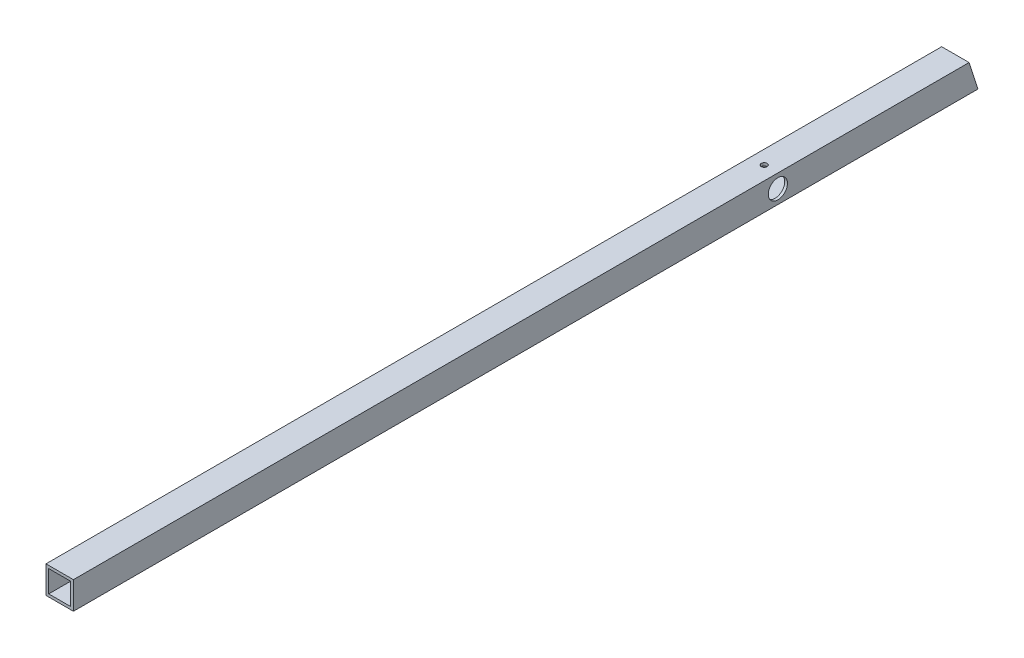
ISO-10303-21;
HEADER;
FILE_DESCRIPTION(('STEP AP214'),'2;1');
FILE_NAME('part.step','',(''),(''),'','','');
FILE_SCHEMA(('AUTOMOTIVE_DESIGN { 1 0 10303 214 1 1 1 1 }'));
ENDSEC;
DATA;
#1=APPLICATION_CONTEXT('core data for automotive mechanical design processes');
#2=APPLICATION_PROTOCOL_DEFINITION('international standard','automotive_design',2000,#1);
#3=PRODUCT_CONTEXT('',#1,'mechanical');
#4=PRODUCT('Part','Part','',(#3));
#5=PRODUCT_RELATED_PRODUCT_CATEGORY('part','',(#4));
#6=PRODUCT_DEFINITION_FORMATION('','',#4);
#7=PRODUCT_DEFINITION_CONTEXT('part definition',#1,'design');
#8=PRODUCT_DEFINITION('design','',#6,#7);
#9=PRODUCT_DEFINITION_SHAPE('','',#8);
#10=(LENGTH_UNIT() NAMED_UNIT(*) SI_UNIT(.MILLI.,.METRE.));
#11=(NAMED_UNIT(*) PLANE_ANGLE_UNIT() SI_UNIT($,.RADIAN.));
#12=(NAMED_UNIT(*) SI_UNIT($,.STERADIAN.) SOLID_ANGLE_UNIT());
#13=UNCERTAINTY_MEASURE_WITH_UNIT(LENGTH_MEASURE(1.E-05),#10,'distance_accuracy_value','');
#14=(GEOMETRIC_REPRESENTATION_CONTEXT(3) GLOBAL_UNCERTAINTY_ASSIGNED_CONTEXT((#13)) GLOBAL_UNIT_ASSIGNED_CONTEXT((#10,
#11,#12)) REPRESENTATION_CONTEXT('',''));
#15=CARTESIAN_POINT('',(0.,0.,0.));
#16=DIRECTION('',(0.,0.,1.));
#17=DIRECTION('',(1.,0.,0.));
#18=AXIS2_PLACEMENT_3D('',#15,#16,#17);
#19=CARTESIAN_POINT('',(15.875,31.75,231.775));
#20=DIRECTION('',(0.,1.,0.));
#21=DIRECTION('',(0.,0.,1.));
#22=AXIS2_PLACEMENT_3D('',#19,#20,#21);
#23=CYLINDRICAL_SURFACE('',#22,3.3655);
#24=CARTESIAN_POINT('',(15.875,28.575,231.775));
#25=DIRECTION('',(0.,1.,0.));
#26=DIRECTION('',(0.,0.,1.));
#27=AXIS2_PLACEMENT_3D('',#24,#25,#26);
#28=CIRCLE('',#27,3.3655);
#29=CARTESIAN_POINT('',(15.875,28.575,235.1405));
#30=VERTEX_POINT('',#29);
#31=EDGE_CURVE('E87',#30,#30,#28,.F.);
#32=ORIENTED_EDGE('',*,*,#31,.T.);
#33=EDGE_LOOP('',(#32));
#34=FACE_BOUND('',#33,.T.);
#35=CARTESIAN_POINT('',(15.875,31.75,231.775));
#36=DIRECTION('',(0.,1.,0.));
#37=DIRECTION('',(0.,0.,1.));
#38=AXIS2_PLACEMENT_3D('',#35,#36,#37);
#39=CIRCLE('',#38,3.3655);
#40=CARTESIAN_POINT('',(15.875,31.75,235.1405));
#41=VERTEX_POINT('',#40);
#42=EDGE_CURVE('E19',#41,#41,#39,.F.);
#43=ORIENTED_EDGE('',*,*,#42,.F.);
#44=EDGE_LOOP('',(#43));
#45=FACE_BOUND('',#44,.T.);
#46=ADVANCED_FACE('F16',(#34,#45),#23,.F.);
#47=CARTESIAN_POINT('',(31.75,15.875,231.775));
#48=DIRECTION('',(1.,0.,0.));
#49=DIRECTION('',(0.,0.,-1.));
#50=AXIS2_PLACEMENT_3D('',#47,#48,#49);
#51=CYLINDRICAL_SURFACE('',#50,11.1125);
#52=CARTESIAN_POINT('',(28.575,15.875,231.775));
#53=DIRECTION('',(1.,0.,0.));
#54=DIRECTION('',(0.,0.,-1.));
#55=AXIS2_PLACEMENT_3D('',#52,#53,#54);
#56=CIRCLE('',#55,11.1125);
#57=CARTESIAN_POINT('',(28.575,15.875,220.6625));
#58=VERTEX_POINT('',#57);
#59=EDGE_CURVE('E121',#58,#58,#56,.F.);
#60=ORIENTED_EDGE('',*,*,#59,.T.);
#61=EDGE_LOOP('',(#60));
#62=FACE_BOUND('',#61,.T.);
#63=CARTESIAN_POINT('',(31.75,15.875,231.775));
#64=DIRECTION('',(1.,0.,0.));
#65=DIRECTION('',(0.,0.,-1.));
#66=AXIS2_PLACEMENT_3D('',#63,#64,#65);
#67=CIRCLE('',#66,11.1125);
#68=CARTESIAN_POINT('',(31.75,15.875,220.6625));
#69=VERTEX_POINT('',#68);
#70=EDGE_CURVE('E113',#69,#69,#67,.F.);
#71=ORIENTED_EDGE('',*,*,#70,.F.);
#72=EDGE_LOOP('',(#71));
#73=FACE_BOUND('',#72,.T.);
#74=ADVANCED_FACE('F147',(#62,#73),#51,.F.);
#75=CARTESIAN_POINT('',(31.75,15.875,231.775));
#76=DIRECTION('',(1.,0.,0.));
#77=DIRECTION('',(0.,0.,-1.));
#78=AXIS2_PLACEMENT_3D('',#75,#76,#77);
#79=CYLINDRICAL_SURFACE('',#78,11.1125);
#80=CARTESIAN_POINT('',(3.175,15.875,231.775));
#81=DIRECTION('',(1.,0.,0.));
#82=DIRECTION('',(0.,0.,-1.));
#83=AXIS2_PLACEMENT_3D('',#80,#81,#82);
#84=CIRCLE('',#83,11.1125);
#85=CARTESIAN_POINT('',(3.175,15.875,220.6625));
#86=VERTEX_POINT('',#85);
#87=EDGE_CURVE('E88',#86,#86,#84,.T.);
#88=ORIENTED_EDGE('',*,*,#87,.T.);
#89=EDGE_LOOP('',(#88));
#90=FACE_BOUND('',#89,.T.);
#91=CARTESIAN_POINT('',(0.,15.875,231.775));
#92=DIRECTION('',(1.,0.,0.));
#93=DIRECTION('',(0.,0.,-1.));
#94=AXIS2_PLACEMENT_3D('',#91,#92,#93);
#95=CIRCLE('',#94,11.1125);
#96=CARTESIAN_POINT('',(0.,15.875,220.6625));
#97=VERTEX_POINT('',#96);
#98=EDGE_CURVE('E128',#97,#97,#95,.T.);
#99=ORIENTED_EDGE('',*,*,#98,.F.);
#100=EDGE_LOOP('',(#99));
#101=FACE_BOUND('',#100,.T.);
#102=ADVANCED_FACE('F153',(#90,#101),#79,.F.);
#103=CARTESIAN_POINT('',(31.75,31.75,0.));
#104=DIRECTION('',(0.,1.,0.));
#105=DIRECTION('',(0.,0.,1.));
#106=AXIS2_PLACEMENT_3D('',#103,#104,#105);
#107=PLANE('',#106);
#108=ORIENTED_EDGE('',*,*,#42,.T.);
#109=EDGE_LOOP('',(#108));
#110=FACE_BOUND('',#109,.T.);
#111=DIRECTION('',(0.,0.,-1.));
#112=VECTOR('',#111,1.);
#113=CARTESIAN_POINT('',(31.75,31.75,0.));
#114=LINE('',#113,#112);
#115=CARTESIAN_POINT('',(31.75,31.75,10.3162003553939));
#116=VERTEX_POINT('',#115);
#117=CARTESIAN_POINT('',(31.75,31.75,1047.75));
#118=VERTEX_POINT('',#117);
#119=EDGE_CURVE('E114',#116,#118,#114,.F.);
#120=ORIENTED_EDGE('',*,*,#119,.F.);
#121=DIRECTION('',(1.,0.,0.));
#122=VECTOR('',#121,1.);
#123=CARTESIAN_POINT('',(31.75,31.75,10.3162003553939));
#124=LINE('',#123,#122);
#125=CARTESIAN_POINT('',(0.,31.75,10.3162003553939));
#126=VERTEX_POINT('',#125);
#127=EDGE_CURVE('E209',#116,#126,#124,.F.);
#128=ORIENTED_EDGE('',*,*,#127,.T.);
#129=DIRECTION('',(0.,0.,1.));
#130=VECTOR('',#129,1.);
#131=CARTESIAN_POINT('',(0.,31.75,0.));
#132=LINE('',#131,#130);
#133=CARTESIAN_POINT('',(0.,31.75,1047.75));
#134=VERTEX_POINT('',#133);
#135=EDGE_CURVE('E131',#134,#126,#132,.F.);
#136=ORIENTED_EDGE('',*,*,#135,.F.);
#137=DIRECTION('',(1.,0.,0.));
#138=VECTOR('',#137,1.);
#139=CARTESIAN_POINT('',(0.,31.75,1047.75));
#140=LINE('',#139,#138);
#141=EDGE_CURVE('E105',#118,#134,#140,.F.);
#142=ORIENTED_EDGE('',*,*,#141,.F.);
#143=EDGE_LOOP('',(#120,#128,#136,#142));
#144=FACE_BOUND('',#143,.T.);
#145=ADVANCED_FACE('F143',(#110,#144),#107,.T.);
#146=CARTESIAN_POINT('',(3.175,31.75,0.));
#147=DIRECTION('',(-1.,0.,0.));
#148=DIRECTION('',(0.,0.,1.));
#149=AXIS2_PLACEMENT_3D('',#146,#147,#148);
#150=PLANE('',#149);
#151=ORIENTED_EDGE('',*,*,#87,.F.);
#152=EDGE_LOOP('',(#151));
#153=FACE_BOUND('',#152,.T.);
#154=DIRECTION('',(0.,1.,0.));
#155=VECTOR('',#154,1.);
#156=CARTESIAN_POINT('',(3.175,0.,1047.75));
#157=LINE('',#156,#155);
#158=CARTESIAN_POINT('',(3.175,3.175,1047.75));
#159=VERTEX_POINT('',#158);
#160=CARTESIAN_POINT('',(3.175,28.575,1047.75));
#161=VERTEX_POINT('',#160);
#162=EDGE_CURVE('E81',#159,#161,#157,.T.);
#163=ORIENTED_EDGE('',*,*,#162,.F.);
#164=DIRECTION('',(0.,0.,-1.));
#165=VECTOR('',#164,1.);
#166=CARTESIAN_POINT('',(3.175,3.175,0.));
#167=LINE('',#166,#165);
#168=CARTESIAN_POINT('',(3.175,3.17499999999994,1.03162003554023));
#169=VERTEX_POINT('',#168);
#170=EDGE_CURVE('E117',#159,#169,#167,.T.);
#171=ORIENTED_EDGE('',*,*,#170,.T.);
#172=DIRECTION('',(0.,-0.951056516295172,-0.309016994374891));
#173=VECTOR('',#172,1.);
#174=CARTESIAN_POINT('',(3.175,31.75,10.3162003553939));
#175=LINE('',#174,#173);
#176=CARTESIAN_POINT('',(3.175,28.575,9.28458031985477));
#177=VERTEX_POINT('',#176);
#178=EDGE_CURVE('E84',#169,#177,#175,.F.);
#179=ORIENTED_EDGE('',*,*,#178,.T.);
#180=DIRECTION('',(0.,0.,1.));
#181=VECTOR('',#180,1.);
#182=CARTESIAN_POINT('',(3.175,28.575,0.));
#183=LINE('',#182,#181);
#184=EDGE_CURVE('E77',#177,#161,#183,.T.);
#185=ORIENTED_EDGE('',*,*,#184,.T.);
#186=EDGE_LOOP('',(#163,#171,#179,#185));
#187=FACE_BOUND('',#186,.T.);
#188=ADVANCED_FACE('F79',(#153,#187),#150,.F.);
#189=CARTESIAN_POINT('',(31.75,28.575,0.));
#190=DIRECTION('',(0.,1.,0.));
#191=DIRECTION('',(0.,0.,1.));
#192=AXIS2_PLACEMENT_3D('',#189,#190,#191);
#193=PLANE('',#192);
#194=ORIENTED_EDGE('',*,*,#31,.F.);
#195=EDGE_LOOP('',(#194));
#196=FACE_BOUND('',#195,.T.);
#197=DIRECTION('',(1.,0.,0.));
#198=VECTOR('',#197,1.);
#199=CARTESIAN_POINT('',(0.,28.575,1047.75));
#200=LINE('',#199,#198);
#201=CARTESIAN_POINT('',(28.575,28.575,1047.75));
#202=VERTEX_POINT('',#201);
#203=EDGE_CURVE('E91',#161,#202,#200,.T.);
#204=ORIENTED_EDGE('',*,*,#203,.F.);
#205=ORIENTED_EDGE('',*,*,#184,.F.);
#206=DIRECTION('',(1.,0.,0.));
#207=VECTOR('',#206,1.);
#208=CARTESIAN_POINT('',(31.75,28.575,9.28458031985468));
#209=LINE('',#208,#207);
#210=CARTESIAN_POINT('',(28.575,28.575,9.28458031985477));
#211=VERTEX_POINT('',#210);
#212=EDGE_CURVE('E229',#177,#211,#209,.T.);
#213=ORIENTED_EDGE('',*,*,#212,.T.);
#214=DIRECTION('',(0.,0.,-1.));
#215=VECTOR('',#214,1.);
#216=CARTESIAN_POINT('',(28.575,28.575,0.));
#217=LINE('',#216,#215);
#218=EDGE_CURVE('E94',#211,#202,#217,.F.);
#219=ORIENTED_EDGE('',*,*,#218,.T.);
#220=EDGE_LOOP('',(#204,#205,#213,#219));
#221=FACE_BOUND('',#220,.T.);
#222=ADVANCED_FACE('F92',(#196,#221),#193,.F.);
#223=CARTESIAN_POINT('',(28.575,0.,0.));
#224=DIRECTION('',(1.,0.,0.));
#225=DIRECTION('',(0.,0.,-1.));
#226=AXIS2_PLACEMENT_3D('',#223,#224,#225);
#227=PLANE('',#226);
#228=ORIENTED_EDGE('',*,*,#59,.F.);
#229=EDGE_LOOP('',(#228));
#230=FACE_BOUND('',#229,.T.);
#231=DIRECTION('',(0.,1.,0.));
#232=VECTOR('',#231,1.);
#233=CARTESIAN_POINT('',(28.575,0.,1047.75));
#234=LINE('',#233,#232);
#235=CARTESIAN_POINT('',(28.575,3.175,1047.75));
#236=VERTEX_POINT('',#235);
#237=EDGE_CURVE('E98',#202,#236,#234,.F.);
#238=ORIENTED_EDGE('',*,*,#237,.F.);
#239=ORIENTED_EDGE('',*,*,#218,.F.);
#240=DIRECTION('',(0.,-0.951056516295172,-0.309016994374891));
#241=VECTOR('',#240,1.);
#242=CARTESIAN_POINT('',(28.575,31.75,10.3162003553939));
#243=LINE('',#242,#241);
#244=CARTESIAN_POINT('',(28.575,3.17499999999994,1.0316200355401));
#245=VERTEX_POINT('',#244);
#246=EDGE_CURVE('E127',#211,#245,#243,.T.);
#247=ORIENTED_EDGE('',*,*,#246,.T.);
#248=DIRECTION('',(0.,0.,-1.));
#249=VECTOR('',#248,1.);
#250=CARTESIAN_POINT('',(28.575,3.175,0.));
#251=LINE('',#250,#249);
#252=EDGE_CURVE('E119',#245,#236,#251,.F.);
#253=ORIENTED_EDGE('',*,*,#252,.T.);
#254=EDGE_LOOP('',(#238,#239,#247,#253));
#255=FACE_BOUND('',#254,.T.);
#256=ADVANCED_FACE('F184',(#230,#255),#227,.F.);
#257=CARTESIAN_POINT('',(0.,3.175,0.));
#258=DIRECTION('',(0.,-1.,0.));
#259=DIRECTION('',(0.,0.,-1.));
#260=AXIS2_PLACEMENT_3D('',#257,#258,#259);
#261=PLANE('',#260);
#262=CARTESIAN_POINT('',(15.875,3.175,231.775));
#263=DIRECTION('',(0.,1.,0.));
#264=DIRECTION('',(0.,0.,1.));
#265=AXIS2_PLACEMENT_3D('',#262,#263,#264);
#266=CIRCLE('',#265,3.3655);
#267=CARTESIAN_POINT('',(15.875,3.175,235.1405));
#268=VERTEX_POINT('',#267);
#269=EDGE_CURVE('E123',#268,#268,#266,.F.);
#270=ORIENTED_EDGE('',*,*,#269,.T.);
#271=EDGE_LOOP('',(#270));
#272=FACE_BOUND('',#271,.T.);
#273=DIRECTION('',(1.,0.,0.));
#274=VECTOR('',#273,1.);
#275=CARTESIAN_POINT('',(0.,3.175,1047.75));
#276=LINE('',#275,#274);
#277=EDGE_CURVE('E104',#236,#159,#276,.F.);
#278=ORIENTED_EDGE('',*,*,#277,.F.);
#279=ORIENTED_EDGE('',*,*,#252,.F.);
#280=DIRECTION('',(1.,0.,0.));
#281=VECTOR('',#280,1.);
#282=CARTESIAN_POINT('',(31.75,3.17499999999974,1.03162003554044));
#283=LINE('',#282,#281);
#284=EDGE_CURVE('E213',#245,#169,#283,.F.);
#285=ORIENTED_EDGE('',*,*,#284,.T.);
#286=ORIENTED_EDGE('',*,*,#170,.F.);
#287=EDGE_LOOP('',(#278,#279,#285,#286));
#288=FACE_BOUND('',#287,.T.);
#289=ADVANCED_FACE('F180',(#272,#288),#261,.F.);
#290=CARTESIAN_POINT('',(31.75,0.,0.));
#291=DIRECTION('',(1.,0.,0.));
#292=DIRECTION('',(0.,0.,-1.));
#293=AXIS2_PLACEMENT_3D('',#290,#291,#292);
#294=PLANE('',#293);
#295=ORIENTED_EDGE('',*,*,#70,.T.);
#296=EDGE_LOOP('',(#295));
#297=FACE_BOUND('',#296,.T.);
#298=DIRECTION('',(0.,0.,-1.));
#299=VECTOR('',#298,1.);
#300=CARTESIAN_POINT('',(31.75,0.,0.));
#301=LINE('',#300,#299);
#302=CARTESIAN_POINT('',(31.75,0.,8.97466958146176E-13));
#303=VERTEX_POINT('',#302);
#304=CARTESIAN_POINT('',(31.75,0.,1047.75));
#305=VERTEX_POINT('',#304);
#306=EDGE_CURVE('E126',#303,#305,#301,.F.);
#307=ORIENTED_EDGE('',*,*,#306,.F.);
#308=DIRECTION('',(0.,-0.951056516295172,-0.309016994374891));
#309=VECTOR('',#308,1.);
#310=CARTESIAN_POINT('',(31.75,31.75,10.3162003553939));
#311=LINE('',#310,#309);
#312=EDGE_CURVE('E214',#303,#116,#311,.F.);
#313=ORIENTED_EDGE('',*,*,#312,.T.);
#314=ORIENTED_EDGE('',*,*,#119,.T.);
#315=DIRECTION('',(0.,1.,0.));
#316=VECTOR('',#315,1.);
#317=CARTESIAN_POINT('',(31.75,0.,1047.75));
#318=LINE('',#317,#316);
#319=EDGE_CURVE('E107',#305,#118,#318,.T.);
#320=ORIENTED_EDGE('',*,*,#319,.F.);
#321=EDGE_LOOP('',(#307,#313,#314,#320));
#322=FACE_BOUND('',#321,.T.);
#323=ADVANCED_FACE('F177',(#297,#322),#294,.T.);
#324=CARTESIAN_POINT('',(0.,0.,1047.75));
#325=DIRECTION('',(0.,0.,1.));
#326=DIRECTION('',(1.,0.,0.));
#327=AXIS2_PLACEMENT_3D('',#324,#325,#326);
#328=PLANE('',#327);
#329=ORIENTED_EDGE('',*,*,#237,.T.);
#330=ORIENTED_EDGE('',*,*,#277,.T.);
#331=ORIENTED_EDGE('',*,*,#162,.T.);
#332=ORIENTED_EDGE('',*,*,#203,.T.);
#333=EDGE_LOOP('',(#329,#330,#331,#332));
#334=FACE_BOUND('',#333,.T.);
#335=DIRECTION('',(0.,1.,0.));
#336=VECTOR('',#335,1.);
#337=CARTESIAN_POINT('',(0.,31.75,1047.75));
#338=LINE('',#337,#336);
#339=CARTESIAN_POINT('',(0.,0.,1047.75));
#340=VERTEX_POINT('',#339);
#341=EDGE_CURVE('E205',#340,#134,#338,.T.);
#342=ORIENTED_EDGE('',*,*,#341,.F.);
#343=DIRECTION('',(1.,0.,0.));
#344=VECTOR('',#343,1.);
#345=CARTESIAN_POINT('',(0.,0.,1047.75));
#346=LINE('',#345,#344);
#347=EDGE_CURVE('E236',#305,#340,#346,.F.);
#348=ORIENTED_EDGE('',*,*,#347,.F.);
#349=ORIENTED_EDGE('',*,*,#319,.T.);
#350=ORIENTED_EDGE('',*,*,#141,.T.);
#351=EDGE_LOOP('',(#342,#348,#349,#350));
#352=FACE_BOUND('',#351,.T.);
#353=ADVANCED_FACE('F101',(#334,#352),#328,.T.);
#354=CARTESIAN_POINT('',(0.,31.75,0.));
#355=DIRECTION('',(-1.,0.,0.));
#356=DIRECTION('',(0.,0.,1.));
#357=AXIS2_PLACEMENT_3D('',#354,#355,#356);
#358=PLANE('',#357);
#359=ORIENTED_EDGE('',*,*,#98,.T.);
#360=EDGE_LOOP('',(#359));
#361=FACE_BOUND('',#360,.T.);
#362=ORIENTED_EDGE('',*,*,#135,.T.);
#363=DIRECTION('',(0.,-0.951056516295172,-0.309016994374891));
#364=VECTOR('',#363,1.);
#365=CARTESIAN_POINT('',(0.,31.75,10.3162003553939));
#366=LINE('',#365,#364);
#367=CARTESIAN_POINT('',(0.,0.,9.00247685353669E-13));
#368=VERTEX_POINT('',#367);
#369=EDGE_CURVE('E34',#126,#368,#366,.T.);
#370=ORIENTED_EDGE('',*,*,#369,.T.);
#371=DIRECTION('',(0.,0.,-1.));
#372=VECTOR('',#371,1.);
#373=CARTESIAN_POINT('',(0.,0.,0.));
#374=LINE('',#373,#372);
#375=EDGE_CURVE('E239',#340,#368,#374,.T.);
#376=ORIENTED_EDGE('',*,*,#375,.F.);
#377=ORIENTED_EDGE('',*,*,#341,.T.);
#378=EDGE_LOOP('',(#362,#370,#376,#377));
#379=FACE_BOUND('',#378,.T.);
#380=ADVANCED_FACE('F170',(#361,#379),#358,.T.);
#381=CARTESIAN_POINT('',(31.75,31.75,10.3162003553939));
#382=DIRECTION('',(0.,-0.309016994374891,0.951056516295172));
#383=DIRECTION('',(0.,-0.951056516295172,-0.309016994374891));
#384=AXIS2_PLACEMENT_3D('',#381,#382,#383);
#385=PLANE('',#384);
#386=ORIENTED_EDGE('',*,*,#212,.F.);
#387=ORIENTED_EDGE('',*,*,#178,.F.);
#388=ORIENTED_EDGE('',*,*,#284,.F.);
#389=ORIENTED_EDGE('',*,*,#246,.F.);
#390=EDGE_LOOP('',(#386,#387,#388,#389));
#391=FACE_BOUND('',#390,.T.);
#392=ORIENTED_EDGE('',*,*,#312,.F.);
#393=DIRECTION('',(1.,0.,0.));
#394=VECTOR('',#393,1.);
#395=CARTESIAN_POINT('',(0.,0.,7.94166764434948E-13));
#396=LINE('',#395,#394);
#397=EDGE_CURVE('E25',#368,#303,#396,.T.);
#398=ORIENTED_EDGE('',*,*,#397,.F.);
#399=ORIENTED_EDGE('',*,*,#369,.F.);
#400=ORIENTED_EDGE('',*,*,#127,.F.);
#401=EDGE_LOOP('',(#392,#398,#399,#400));
#402=FACE_BOUND('',#401,.T.);
#403=ADVANCED_FACE('F163',(#391,#402),#385,.F.);
#404=CARTESIAN_POINT('',(15.875,31.75,231.775));
#405=DIRECTION('',(0.,1.,0.));
#406=DIRECTION('',(0.,0.,1.));
#407=AXIS2_PLACEMENT_3D('',#404,#405,#406);
#408=CYLINDRICAL_SURFACE('',#407,3.3655);
#409=ORIENTED_EDGE('',*,*,#269,.F.);
#410=EDGE_LOOP('',(#409));
#411=FACE_BOUND('',#410,.T.);
#412=CARTESIAN_POINT('',(15.875,0.,231.775));
#413=DIRECTION('',(0.,1.,0.));
#414=DIRECTION('',(0.,0.,1.));
#415=AXIS2_PLACEMENT_3D('',#412,#413,#414);
#416=CIRCLE('',#415,3.3655);
#417=CARTESIAN_POINT('',(15.875,0.,235.1405));
#418=VERTEX_POINT('',#417);
#419=EDGE_CURVE('E11',#418,#418,#416,.T.);
#420=ORIENTED_EDGE('',*,*,#419,.F.);
#421=EDGE_LOOP('',(#420));
#422=FACE_BOUND('',#421,.T.);
#423=ADVANCED_FACE('F157',(#411,#422),#408,.F.);
#424=CARTESIAN_POINT('',(0.,0.,0.));
#425=DIRECTION('',(0.,-1.,0.));
#426=DIRECTION('',(0.,0.,-1.));
#427=AXIS2_PLACEMENT_3D('',#424,#425,#426);
#428=PLANE('',#427);
#429=ORIENTED_EDGE('',*,*,#419,.T.);
#430=EDGE_LOOP('',(#429));
#431=FACE_BOUND('',#430,.T.);
#432=ORIENTED_EDGE('',*,*,#375,.T.);
#433=ORIENTED_EDGE('',*,*,#397,.T.);
#434=ORIENTED_EDGE('',*,*,#306,.T.);
#435=ORIENTED_EDGE('',*,*,#347,.T.);
#436=EDGE_LOOP('',(#432,#433,#434,#435));
#437=FACE_BOUND('',#436,.T.);
#438=ADVANCED_FACE('F155',(#431,#437),#428,.T.);
#439=CLOSED_SHELL('',(#46,#74,#102,#145,#188,#222,#256,#289,#323,#353,#380,#403,#423,#438));
#440=MANIFOLD_SOLID_BREP('B1',#439);
#441=ADVANCED_BREP_SHAPE_REPRESENTATION('',(#18,#440),#14);
#442=SHAPE_DEFINITION_REPRESENTATION(#9,#441);
ENDSEC;
END-ISO-10303-21;
